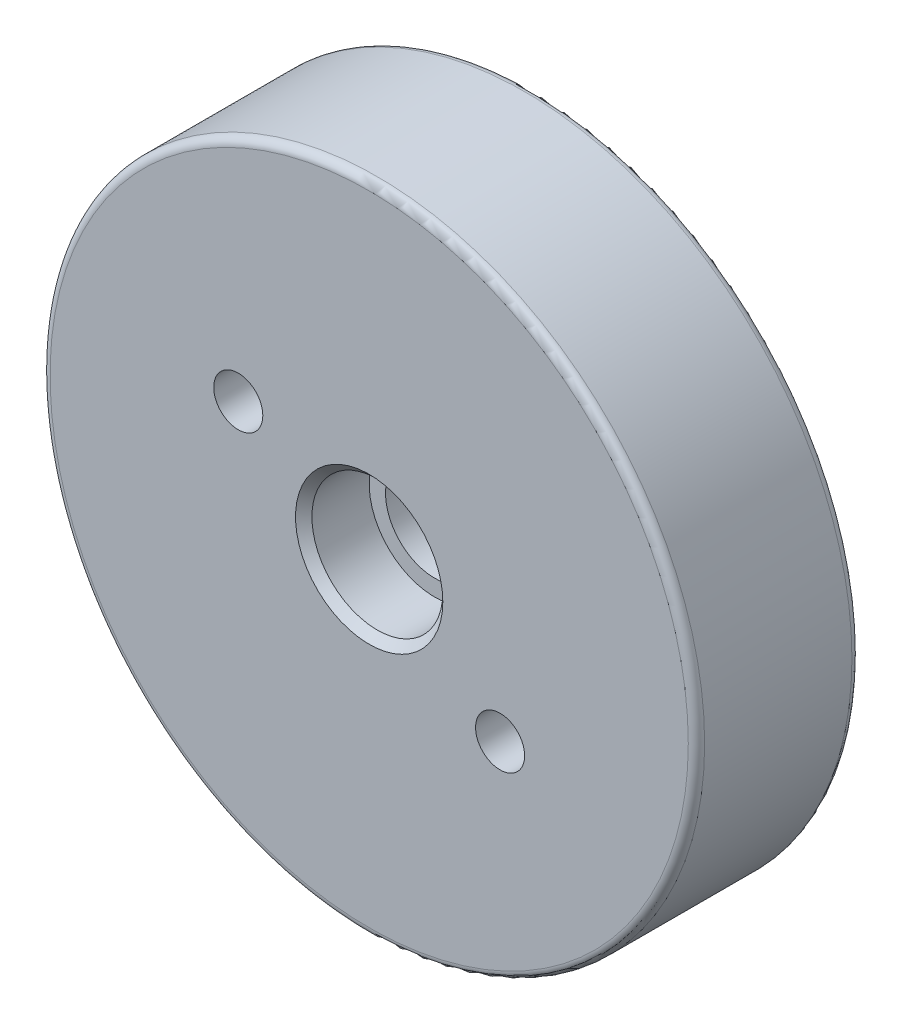
ISO-10303-21;
HEADER;
FILE_DESCRIPTION(('STEP AP214'),'2;1');
FILE_NAME('part.step','',(''),(''),'','','');
FILE_SCHEMA(('AUTOMOTIVE_DESIGN { 1 0 10303 214 1 1 1 1 }'));
ENDSEC;
DATA;
#1=APPLICATION_CONTEXT('core data for automotive mechanical design processes');
#2=APPLICATION_PROTOCOL_DEFINITION('international standard','automotive_design',2000,#1);
#3=PRODUCT_CONTEXT('',#1,'mechanical');
#4=PRODUCT('Part','Part','',(#3));
#5=PRODUCT_RELATED_PRODUCT_CATEGORY('part','',(#4));
#6=PRODUCT_DEFINITION_FORMATION('','',#4);
#7=PRODUCT_DEFINITION_CONTEXT('part definition',#1,'design');
#8=PRODUCT_DEFINITION('design','',#6,#7);
#9=PRODUCT_DEFINITION_SHAPE('','',#8);
#10=(LENGTH_UNIT() NAMED_UNIT(*) SI_UNIT(.MILLI.,.METRE.));
#11=(NAMED_UNIT(*) PLANE_ANGLE_UNIT() SI_UNIT($,.RADIAN.));
#12=(NAMED_UNIT(*) SI_UNIT($,.STERADIAN.) SOLID_ANGLE_UNIT());
#13=UNCERTAINTY_MEASURE_WITH_UNIT(LENGTH_MEASURE(1.E-05),#10,'distance_accuracy_value','');
#14=(GEOMETRIC_REPRESENTATION_CONTEXT(3) GLOBAL_UNCERTAINTY_ASSIGNED_CONTEXT((#13)) GLOBAL_UNIT_ASSIGNED_CONTEXT((#10,
#11,#12)) REPRESENTATION_CONTEXT('',''));
#15=CARTESIAN_POINT('',(0.,0.,0.));
#16=DIRECTION('',(0.,0.,1.));
#17=DIRECTION('',(1.,0.,0.));
#18=AXIS2_PLACEMENT_3D('',#15,#16,#17);
#19=CARTESIAN_POINT('',(0.,0.,0.));
#20=DIRECTION('',(0.,0.,1.));
#21=DIRECTION('',(1.,0.,0.));
#22=AXIS2_PLACEMENT_3D('',#19,#20,#21);
#23=CYLINDRICAL_SURFACE('',#22,3.);
#24=CARTESIAN_POINT('',(0.,0.,0.499999999999999));
#25=DIRECTION('',(0.,0.,1.));
#26=DIRECTION('',(1.,0.,0.));
#27=AXIS2_PLACEMENT_3D('',#24,#25,#26);
#28=CIRCLE('',#27,3.);
#29=CARTESIAN_POINT('',(3.,0.,0.499999999999999));
#30=VERTEX_POINT('',#29);
#31=EDGE_CURVE('E41',#30,#30,#28,.F.);
#32=ORIENTED_EDGE('',*,*,#31,.T.);
#33=EDGE_LOOP('',(#32));
#34=FACE_BOUND('',#33,.T.);
#35=CARTESIAN_POINT('',(0.,0.,6.));
#36=DIRECTION('',(0.,0.,1.));
#37=DIRECTION('',(1.,0.,0.));
#38=AXIS2_PLACEMENT_3D('',#35,#36,#37);
#39=CIRCLE('',#38,3.);
#40=CARTESIAN_POINT('',(3.,0.,6.));
#41=VERTEX_POINT('',#40);
#42=EDGE_CURVE('E62',#41,#41,#39,.F.);
#43=ORIENTED_EDGE('',*,*,#42,.F.);
#44=EDGE_LOOP('',(#43));
#45=FACE_BOUND('',#44,.T.);
#46=ADVANCED_FACE('F30',(#34,#45),#23,.F.);
#47=CARTESIAN_POINT('',(0.,0.,10.));
#48=DIRECTION('',(0.,0.,-1.));
#49=DIRECTION('',(-1.,0.,0.));
#50=AXIS2_PLACEMENT_3D('',#47,#48,#49);
#51=CYLINDRICAL_SURFACE('',#50,20.);
#52=CARTESIAN_POINT('',(0.,0.,0.5));
#53=DIRECTION('',(0.,0.,1.));
#54=DIRECTION('',(1.,0.,0.));
#55=AXIS2_PLACEMENT_3D('',#52,#53,#54);
#56=CIRCLE('',#55,20.);
#57=CARTESIAN_POINT('',(20.,0.,0.5));
#58=VERTEX_POINT('',#57);
#59=EDGE_CURVE('E56',#58,#58,#56,.T.);
#60=ORIENTED_EDGE('',*,*,#59,.T.);
#61=EDGE_LOOP('',(#60));
#62=FACE_BOUND('',#61,.T.);
#63=CARTESIAN_POINT('',(0.,0.,9.5));
#64=DIRECTION('',(0.,0.,1.));
#65=DIRECTION('',(1.,0.,0.));
#66=AXIS2_PLACEMENT_3D('',#63,#64,#65);
#67=CIRCLE('',#66,20.);
#68=CARTESIAN_POINT('',(20.,0.,9.5));
#69=VERTEX_POINT('',#68);
#70=EDGE_CURVE('E59',#69,#69,#67,.F.);
#71=ORIENTED_EDGE('',*,*,#70,.T.);
#72=EDGE_LOOP('',(#71));
#73=FACE_BOUND('',#72,.T.);
#74=ADVANCED_FACE('F94',(#62,#73),#51,.T.);
#75=CARTESIAN_POINT('',(0.,0.,10.));
#76=DIRECTION('',(0.,0.,1.));
#77=DIRECTION('',(1.,0.,0.));
#78=AXIS2_PLACEMENT_3D('',#75,#76,#77);
#79=PLANE('',#78);
#80=CARTESIAN_POINT('',(8.,-5.64618970108939,10.));
#81=DIRECTION('',(0.,0.,1.));
#82=DIRECTION('',(1.,0.,0.));
#83=AXIS2_PLACEMENT_3D('',#80,#81,#82);
#84=CIRCLE('',#83,1.5);
#85=CARTESIAN_POINT('',(9.5,-5.64618970108939,10.));
#86=VERTEX_POINT('',#85);
#87=EDGE_CURVE('E75',#86,#86,#84,.T.);
#88=ORIENTED_EDGE('',*,*,#87,.F.);
#89=EDGE_LOOP('',(#88));
#90=FACE_BOUND('',#89,.T.);
#91=CARTESIAN_POINT('',(-8.,4.35381029891061,10.));
#92=DIRECTION('',(0.,0.,1.));
#93=DIRECTION('',(1.,0.,0.));
#94=AXIS2_PLACEMENT_3D('',#91,#92,#93);
#95=CIRCLE('',#94,1.5);
#96=CARTESIAN_POINT('',(-6.5,4.35381029891061,10.));
#97=VERTEX_POINT('',#96);
#98=EDGE_CURVE('E69',#97,#97,#95,.T.);
#99=ORIENTED_EDGE('',*,*,#98,.F.);
#100=EDGE_LOOP('',(#99));
#101=FACE_BOUND('',#100,.T.);
#102=CARTESIAN_POINT('',(0.,0.,10.));
#103=DIRECTION('',(0.,0.,1.));
#104=DIRECTION('',(1.,0.,0.));
#105=AXIS2_PLACEMENT_3D('',#102,#103,#104);
#106=CIRCLE('',#105,4.5);
#107=CARTESIAN_POINT('',(4.5,0.,10.));
#108=VERTEX_POINT('',#107);
#109=EDGE_CURVE('E10',#108,#108,#106,.F.);
#110=ORIENTED_EDGE('',*,*,#109,.T.);
#111=EDGE_LOOP('',(#110));
#112=FACE_BOUND('',#111,.T.);
#113=CARTESIAN_POINT('',(0.,0.,10.));
#114=DIRECTION('',(0.,0.,1.));
#115=DIRECTION('',(1.,0.,0.));
#116=AXIS2_PLACEMENT_3D('',#113,#114,#115);
#117=CIRCLE('',#116,19.5);
#118=CARTESIAN_POINT('',(19.5,0.,10.));
#119=VERTEX_POINT('',#118);
#120=EDGE_CURVE('E50',#119,#119,#117,.T.);
#121=ORIENTED_EDGE('',*,*,#120,.T.);
#122=EDGE_LOOP('',(#121));
#123=FACE_BOUND('',#122,.T.);
#124=ADVANCED_FACE('F90',(#90,#101,#112,#123),#79,.T.);
#125=CARTESIAN_POINT('',(0.,0.,0.));
#126=DIRECTION('',(0.,0.,1.));
#127=DIRECTION('',(1.,0.,0.));
#128=AXIS2_PLACEMENT_3D('',#125,#126,#127);
#129=PLANE('',#128);
#130=CARTESIAN_POINT('',(0.,0.,0.));
#131=DIRECTION('',(0.,0.,1.));
#132=DIRECTION('',(1.,0.,0.));
#133=AXIS2_PLACEMENT_3D('',#130,#131,#132);
#134=CIRCLE('',#133,3.5);
#135=CARTESIAN_POINT('',(3.5,0.,0.));
#136=VERTEX_POINT('',#135);
#137=EDGE_CURVE('E45',#136,#136,#134,.T.);
#138=ORIENTED_EDGE('',*,*,#137,.T.);
#139=EDGE_LOOP('',(#138));
#140=FACE_BOUND('',#139,.T.);
#141=CARTESIAN_POINT('',(0.,0.,0.));
#142=DIRECTION('',(0.,0.,1.));
#143=DIRECTION('',(1.,0.,0.));
#144=AXIS2_PLACEMENT_3D('',#141,#142,#143);
#145=CIRCLE('',#144,19.5);
#146=CARTESIAN_POINT('',(19.5,0.,0.));
#147=VERTEX_POINT('',#146);
#148=EDGE_CURVE('E53',#147,#147,#145,.F.);
#149=ORIENTED_EDGE('',*,*,#148,.T.);
#150=EDGE_LOOP('',(#149));
#151=FACE_BOUND('',#150,.T.);
#152=ADVANCED_FACE('F93',(#140,#151),#129,.F.);
#153=CARTESIAN_POINT('',(0.,0.,6.));
#154=DIRECTION('',(0.,0.,1.));
#155=DIRECTION('',(1.,0.,0.));
#156=AXIS2_PLACEMENT_3D('',#153,#154,#155);
#157=PLANE('',#156);
#158=CARTESIAN_POINT('',(0.,0.,6.));
#159=DIRECTION('',(0.,0.,1.));
#160=DIRECTION('',(1.,0.,0.));
#161=AXIS2_PLACEMENT_3D('',#158,#159,#160);
#162=CIRCLE('',#161,4.);
#163=CARTESIAN_POINT('',(4.,0.,6.));
#164=VERTEX_POINT('',#163);
#165=EDGE_CURVE('E65',#164,#164,#162,.T.);
#166=ORIENTED_EDGE('',*,*,#165,.T.);
#167=EDGE_LOOP('',(#166));
#168=FACE_BOUND('',#167,.T.);
#169=ORIENTED_EDGE('',*,*,#42,.T.);
#170=EDGE_LOOP('',(#169));
#171=FACE_BOUND('',#170,.T.);
#172=ADVANCED_FACE('F128',(#168,#171),#157,.T.);
#173=CARTESIAN_POINT('',(0.,0.,6.));
#174=DIRECTION('',(0.,0.,1.));
#175=DIRECTION('',(1.,0.,0.));
#176=AXIS2_PLACEMENT_3D('',#173,#174,#175);
#177=CYLINDRICAL_SURFACE('',#176,4.);
#178=CARTESIAN_POINT('',(0.,0.,9.5));
#179=DIRECTION('',(0.,0.,1.));
#180=DIRECTION('',(1.,0.,0.));
#181=AXIS2_PLACEMENT_3D('',#178,#179,#180);
#182=CIRCLE('',#181,4.);
#183=CARTESIAN_POINT('',(4.,0.,9.5));
#184=VERTEX_POINT('',#183);
#185=EDGE_CURVE('E37',#184,#184,#182,.T.);
#186=ORIENTED_EDGE('',*,*,#185,.T.);
#187=EDGE_LOOP('',(#186));
#188=FACE_BOUND('',#187,.T.);
#189=ORIENTED_EDGE('',*,*,#165,.F.);
#190=EDGE_LOOP('',(#189));
#191=FACE_BOUND('',#190,.T.);
#192=ADVANCED_FACE('F111',(#188,#191),#177,.F.);
#193=CARTESIAN_POINT('',(0.,0.,0.5));
#194=DIRECTION('',(0.,0.,1.));
#195=DIRECTION('',(1.,0.,0.));
#196=AXIS2_PLACEMENT_3D('',#193,#194,#195);
#197=TOROIDAL_SURFACE('',#196,19.5,0.5);
#198=ORIENTED_EDGE('',*,*,#148,.F.);
#199=EDGE_LOOP('',(#198));
#200=FACE_BOUND('',#199,.T.);
#201=ORIENTED_EDGE('',*,*,#59,.F.);
#202=EDGE_LOOP('',(#201));
#203=FACE_BOUND('',#202,.T.);
#204=ADVANCED_FACE('F103',(#200,#203),#197,.T.);
#205=CARTESIAN_POINT('',(0.,0.,9.5));
#206=DIRECTION('',(0.,0.,1.));
#207=DIRECTION('',(1.,0.,0.));
#208=AXIS2_PLACEMENT_3D('',#205,#206,#207);
#209=TOROIDAL_SURFACE('',#208,19.5,0.5);
#210=ORIENTED_EDGE('',*,*,#70,.F.);
#211=EDGE_LOOP('',(#210));
#212=FACE_BOUND('',#211,.T.);
#213=ORIENTED_EDGE('',*,*,#120,.F.);
#214=EDGE_LOOP('',(#213));
#215=FACE_BOUND('',#214,.T.);
#216=ADVANCED_FACE('F100',(#212,#215),#209,.T.);
#217=CARTESIAN_POINT('',(0.,0.,0.));
#218=DIRECTION('',(0.,0.,-1.));
#219=DIRECTION('',(-1.,0.,0.));
#220=AXIS2_PLACEMENT_3D('',#217,#218,#219);
#221=CONICAL_SURFACE('',#220,3.5,0.785398163397452);
#222=ORIENTED_EDGE('',*,*,#31,.F.);
#223=EDGE_LOOP('',(#222));
#224=FACE_BOUND('',#223,.T.);
#225=ORIENTED_EDGE('',*,*,#137,.F.);
#226=EDGE_LOOP('',(#225));
#227=FACE_BOUND('',#226,.T.);
#228=ADVANCED_FACE('F102',(#224,#227),#221,.F.);
#229=CARTESIAN_POINT('',(0.,0.,9.5));
#230=DIRECTION('',(0.,0.,1.));
#231=DIRECTION('',(1.,0.,0.));
#232=AXIS2_PLACEMENT_3D('',#229,#230,#231);
#233=CONICAL_SURFACE('',#232,4.,0.785398163397455);
#234=ORIENTED_EDGE('',*,*,#109,.F.);
#235=EDGE_LOOP('',(#234));
#236=FACE_BOUND('',#235,.T.);
#237=ORIENTED_EDGE('',*,*,#185,.F.);
#238=EDGE_LOOP('',(#237));
#239=FACE_BOUND('',#238,.T.);
#240=ADVANCED_FACE('F32',(#236,#239),#233,.F.);
#241=CARTESIAN_POINT('',(-8.,4.35381029891061,4.));
#242=DIRECTION('',(0.,0.,1.));
#243=DIRECTION('',(1.,0.,0.));
#244=AXIS2_PLACEMENT_3D('',#241,#242,#243);
#245=CYLINDRICAL_SURFACE('',#244,1.5);
#246=CARTESIAN_POINT('',(-8.,4.35381029891061,4.));
#247=DIRECTION('',(0.,0.,1.));
#248=DIRECTION('',(1.,0.,0.));
#249=AXIS2_PLACEMENT_3D('',#246,#247,#248);
#250=CIRCLE('',#249,1.5);
#251=CARTESIAN_POINT('',(-6.5,4.35381029891061,4.));
#252=VERTEX_POINT('',#251);
#253=EDGE_CURVE('E68',#252,#252,#250,.T.);
#254=ORIENTED_EDGE('',*,*,#253,.F.);
#255=EDGE_LOOP('',(#254));
#256=FACE_BOUND('',#255,.T.);
#257=ORIENTED_EDGE('',*,*,#98,.T.);
#258=EDGE_LOOP('',(#257));
#259=FACE_BOUND('',#258,.T.);
#260=ADVANCED_FACE('F146',(#256,#259),#245,.F.);
#261=CARTESIAN_POINT('',(-8.,4.35381029891061,4.));
#262=DIRECTION('',(0.,0.,1.));
#263=DIRECTION('',(1.,0.,0.));
#264=AXIS2_PLACEMENT_3D('',#261,#262,#263);
#265=PLANE('',#264);
#266=ORIENTED_EDGE('',*,*,#253,.T.);
#267=EDGE_LOOP('',(#266));
#268=FACE_BOUND('',#267,.T.);
#269=ADVANCED_FACE('F86',(#268),#265,.T.);
#270=CARTESIAN_POINT('',(8.,-5.64618970108939,4.));
#271=DIRECTION('',(0.,0.,1.));
#272=DIRECTION('',(1.,0.,0.));
#273=AXIS2_PLACEMENT_3D('',#270,#271,#272);
#274=CYLINDRICAL_SURFACE('',#273,1.5);
#275=CARTESIAN_POINT('',(8.,-5.64618970108939,4.));
#276=DIRECTION('',(0.,0.,1.));
#277=DIRECTION('',(1.,0.,0.));
#278=AXIS2_PLACEMENT_3D('',#275,#276,#277);
#279=CIRCLE('',#278,1.5);
#280=CARTESIAN_POINT('',(9.5,-5.64618970108939,4.));
#281=VERTEX_POINT('',#280);
#282=EDGE_CURVE('E72',#281,#281,#279,.T.);
#283=ORIENTED_EDGE('',*,*,#282,.F.);
#284=EDGE_LOOP('',(#283));
#285=FACE_BOUND('',#284,.T.);
#286=ORIENTED_EDGE('',*,*,#87,.T.);
#287=EDGE_LOOP('',(#286));
#288=FACE_BOUND('',#287,.T.);
#289=ADVANCED_FACE('F83',(#285,#288),#274,.F.);
#290=CARTESIAN_POINT('',(8.,-5.64618970108939,4.));
#291=DIRECTION('',(0.,0.,1.));
#292=DIRECTION('',(1.,0.,0.));
#293=AXIS2_PLACEMENT_3D('',#290,#291,#292);
#294=PLANE('',#293);
#295=ORIENTED_EDGE('',*,*,#282,.T.);
#296=EDGE_LOOP('',(#295));
#297=FACE_BOUND('',#296,.T.);
#298=ADVANCED_FACE('F81',(#297),#294,.T.);
#299=CLOSED_SHELL('',(#46,#74,#124,#152,#172,#192,#204,#216,#228,#240,#260,#269,#289,#298));
#300=MANIFOLD_SOLID_BREP('B2',#299);
#301=ADVANCED_BREP_SHAPE_REPRESENTATION('',(#18,#300),#14);
#302=SHAPE_DEFINITION_REPRESENTATION(#9,#301);
ENDSEC;
END-ISO-10303-21;
